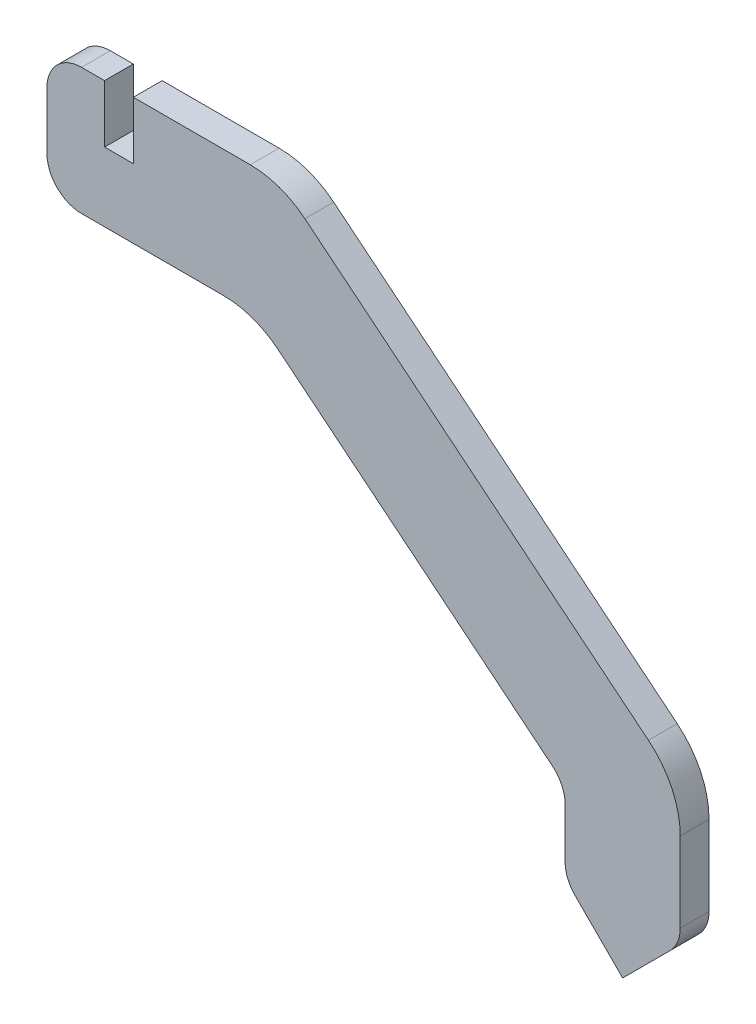
ISO-10303-21;
HEADER;
FILE_DESCRIPTION(('STEP AP214'),'2;1');
FILE_NAME('part.step','',(''),(''),'','','');
FILE_SCHEMA(('AUTOMOTIVE_DESIGN { 1 0 10303 214 1 1 1 1 }'));
ENDSEC;
DATA;
#1=APPLICATION_CONTEXT('core data for automotive mechanical design processes');
#2=APPLICATION_PROTOCOL_DEFINITION('international standard','automotive_design',2000,#1);
#3=PRODUCT_CONTEXT('',#1,'mechanical');
#4=PRODUCT('Part','Part','',(#3));
#5=PRODUCT_RELATED_PRODUCT_CATEGORY('part','',(#4));
#6=PRODUCT_DEFINITION_FORMATION('','',#4);
#7=PRODUCT_DEFINITION_CONTEXT('part definition',#1,'design');
#8=PRODUCT_DEFINITION('design','',#6,#7);
#9=PRODUCT_DEFINITION_SHAPE('','',#8);
#10=(LENGTH_UNIT() NAMED_UNIT(*) SI_UNIT(.MILLI.,.METRE.));
#11=(NAMED_UNIT(*) PLANE_ANGLE_UNIT() SI_UNIT($,.RADIAN.));
#12=(NAMED_UNIT(*) SI_UNIT($,.STERADIAN.) SOLID_ANGLE_UNIT());
#13=UNCERTAINTY_MEASURE_WITH_UNIT(LENGTH_MEASURE(1.E-05),#10,'distance_accuracy_value','');
#14=(GEOMETRIC_REPRESENTATION_CONTEXT(3) GLOBAL_UNCERTAINTY_ASSIGNED_CONTEXT((#13)) GLOBAL_UNIT_ASSIGNED_CONTEXT((#10,
#11,#12)) REPRESENTATION_CONTEXT('',''));
#15=CARTESIAN_POINT('',(0.,0.,0.));
#16=DIRECTION('',(0.,0.,1.));
#17=DIRECTION('',(1.,0.,0.));
#18=AXIS2_PLACEMENT_3D('',#15,#16,#17);
#19=CARTESIAN_POINT('',(1.8,0.,0.125));
#20=DIRECTION('',(0.,1.,0.));
#21=DIRECTION('',(-1.,0.,0.));
#22=AXIS2_PLACEMENT_3D('',#19,#20,#21);
#23=PLANE('',#22);
#24=DIRECTION('',(1.,0.,0.));
#25=VECTOR('',#24,1.);
#26=CARTESIAN_POINT('',(1.8,0.,-0.125));
#27=LINE('',#26,#25);
#28=CARTESIAN_POINT('',(0.3,0.,-0.125));
#29=VERTEX_POINT('',#28);
#30=CARTESIAN_POINT('',(1.53313126586809,0.,-0.125));
#31=VERTEX_POINT('',#30);
#32=EDGE_CURVE('E228',#29,#31,#27,.T.);
#33=ORIENTED_EDGE('',*,*,#32,.T.);
#34=DIRECTION('',(0.,0.,-1.));
#35=VECTOR('',#34,1.);
#36=CARTESIAN_POINT('',(1.53313126586809,0.,0.125));
#37=LINE('',#36,#35);
#38=CARTESIAN_POINT('',(1.53313126586809,0.,0.125));
#39=VERTEX_POINT('',#38);
#40=EDGE_CURVE('E55',#31,#39,#37,.F.);
#41=ORIENTED_EDGE('',*,*,#40,.T.);
#42=DIRECTION('',(1.,0.,0.));
#43=VECTOR('',#42,1.);
#44=CARTESIAN_POINT('',(1.8,0.,0.125));
#45=LINE('',#44,#43);
#46=CARTESIAN_POINT('',(0.3,0.,0.125));
#47=VERTEX_POINT('',#46);
#48=EDGE_CURVE('E258',#47,#39,#45,.T.);
#49=ORIENTED_EDGE('',*,*,#48,.F.);
#50=DIRECTION('',(0.,0.,-1.));
#51=VECTOR('',#50,1.);
#52=CARTESIAN_POINT('',(0.3,0.,0.125));
#53=LINE('',#52,#51);
#54=EDGE_CURVE('E304',#47,#29,#53,.T.);
#55=ORIENTED_EDGE('',*,*,#54,.T.);
#56=EDGE_LOOP('',(#33,#41,#49,#55));
#57=FACE_BOUND('',#56,.T.);
#58=ADVANCED_FACE('F34',(#57),#23,.F.);
#59=CARTESIAN_POINT('',(4.5,-2.2,0.125));
#60=DIRECTION('',(0.631672951162236,0.77523498551729,0.));
#61=DIRECTION('',(-0.77523498551729,0.631672951162236,0.));
#62=AXIS2_PLACEMENT_3D('',#59,#60,#61);
#63=PLANE('',#62);
#64=DIRECTION('',(0.775234985517289,-0.631672951162236,0.));
#65=VECTOR('',#64,1.);
#66=CARTESIAN_POINT('',(4.5,-2.2,0.125));
#67=LINE('',#66,#65);
#68=CARTESIAN_POINT('',(2.00688597923977,-0.168573760862032,0.125));
#69=VERTEX_POINT('',#68);
#70=CARTESIAN_POINT('',(4.38950188534867,-2.10996449917299,0.125));
#71=VERTEX_POINT('',#70);
#72=EDGE_CURVE('E343',#69,#71,#67,.T.);
#73=ORIENTED_EDGE('',*,*,#72,.F.);
#74=DIRECTION('',(0.,0.,-1.));
#75=VECTOR('',#74,1.);
#76=CARTESIAN_POINT('',(2.00688597923977,-0.168573760862032,-0.125));
#77=LINE('',#76,#75);
#78=CARTESIAN_POINT('',(2.00688597923977,-0.168573760862032,-0.125));
#79=VERTEX_POINT('',#78);
#80=EDGE_CURVE('E330',#69,#79,#77,.T.);
#81=ORIENTED_EDGE('',*,*,#80,.T.);
#82=DIRECTION('',(0.775234985517289,-0.631672951162236,0.));
#83=VECTOR('',#82,1.);
#84=CARTESIAN_POINT('',(4.5,-2.2,-0.125));
#85=LINE('',#84,#83);
#86=CARTESIAN_POINT('',(4.38950188534867,-2.10996449917299,-0.125));
#87=VERTEX_POINT('',#86);
#88=EDGE_CURVE('E230',#79,#87,#85,.T.);
#89=ORIENTED_EDGE('',*,*,#88,.T.);
#90=DIRECTION('',(0.,0.,-1.));
#91=VECTOR('',#90,1.);
#92=CARTESIAN_POINT('',(4.38950188534867,-2.10996449917299,0.125));
#93=LINE('',#92,#91);
#94=EDGE_CURVE('E301',#87,#71,#93,.F.);
#95=ORIENTED_EDGE('',*,*,#94,.T.);
#96=EDGE_LOOP('',(#73,#81,#89,#95));
#97=FACE_BOUND('',#96,.T.);
#98=ADVANCED_FACE('F342',(#97),#63,.F.);
#99=CARTESIAN_POINT('',(4.5,-2.9,0.125));
#100=DIRECTION('',(1.,0.,0.));
#101=DIRECTION('',(0.,0.,-1.));
#102=AXIS2_PLACEMENT_3D('',#99,#100,#101);
#103=PLANE('',#102);
#104=DIRECTION('',(0.,-1.,0.));
#105=VECTOR('',#104,1.);
#106=CARTESIAN_POINT('',(4.5,-2.9,-0.125));
#107=LINE('',#106,#105);
#108=CARTESIAN_POINT('',(4.5,-2.34253499482818,-0.125));
#109=VERTEX_POINT('',#108);
#110=CARTESIAN_POINT('',(4.5,-2.77573593128807,-0.125));
#111=VERTEX_POINT('',#110);
#112=EDGE_CURVE('E232',#109,#111,#107,.T.);
#113=ORIENTED_EDGE('',*,*,#112,.T.);
#114=DIRECTION('',(0.,0.,-1.));
#115=VECTOR('',#114,1.);
#116=CARTESIAN_POINT('',(4.5,-2.77573593128807,0.125));
#117=LINE('',#116,#115);
#118=CARTESIAN_POINT('',(4.5,-2.77573593128807,0.125));
#119=VERTEX_POINT('',#118);
#120=EDGE_CURVE('E292',#111,#119,#117,.F.);
#121=ORIENTED_EDGE('',*,*,#120,.T.);
#122=DIRECTION('',(0.,-1.,0.));
#123=VECTOR('',#122,1.);
#124=CARTESIAN_POINT('',(4.5,-2.9,0.125));
#125=LINE('',#124,#123);
#126=CARTESIAN_POINT('',(4.5,-2.34253499482818,0.125));
#127=VERTEX_POINT('',#126);
#128=EDGE_CURVE('E189',#127,#119,#125,.T.);
#129=ORIENTED_EDGE('',*,*,#128,.F.);
#130=DIRECTION('',(0.,0.,-1.));
#131=VECTOR('',#130,1.);
#132=CARTESIAN_POINT('',(4.5,-2.34253499482818,-0.125));
#133=LINE('',#132,#131);
#134=EDGE_CURVE('E289',#127,#109,#133,.T.);
#135=ORIENTED_EDGE('',*,*,#134,.T.);
#136=EDGE_LOOP('',(#113,#121,#129,#135));
#137=FACE_BOUND('',#136,.T.);
#138=ADVANCED_FACE('F409',(#137),#103,.F.);
#139=CARTESIAN_POINT('',(5.,-3.4,0.125));
#140=DIRECTION('',(0.707106781186547,0.707106781186548,0.));
#141=DIRECTION('',(-0.707106781186548,0.707106781186547,0.));
#142=AXIS2_PLACEMENT_3D('',#139,#140,#141);
#143=PLANE('',#142);
#144=DIRECTION('',(0.707106781186548,-0.707106781186547,0.));
#145=VECTOR('',#144,1.);
#146=CARTESIAN_POINT('',(5.,-3.4,0.125));
#147=LINE('',#146,#145);
#148=CARTESIAN_POINT('',(4.58786796564404,-2.98786796564404,0.125));
#149=VERTEX_POINT('',#148);
#150=CARTESIAN_POINT('',(5.,-3.4,0.125));
#151=VERTEX_POINT('',#150);
#152=EDGE_CURVE('E176',#149,#151,#147,.T.);
#153=ORIENTED_EDGE('',*,*,#152,.F.);
#154=DIRECTION('',(0.,0.,-1.));
#155=VECTOR('',#154,1.);
#156=CARTESIAN_POINT('',(4.58786796564404,-2.98786796564404,0.125));
#157=LINE('',#156,#155);
#158=CARTESIAN_POINT('',(4.58786796564404,-2.98786796564404,-0.125));
#159=VERTEX_POINT('',#158);
#160=EDGE_CURVE('E287',#149,#159,#157,.T.);
#161=ORIENTED_EDGE('',*,*,#160,.T.);
#162=DIRECTION('',(0.707106781186548,-0.707106781186547,0.));
#163=VECTOR('',#162,1.);
#164=CARTESIAN_POINT('',(5.,-3.4,-0.125));
#165=LINE('',#164,#163);
#166=CARTESIAN_POINT('',(5.,-3.4,-0.125));
#167=VERTEX_POINT('',#166);
#168=EDGE_CURVE('E195',#159,#167,#165,.T.);
#169=ORIENTED_EDGE('',*,*,#168,.T.);
#170=DIRECTION('',(0.,0.,-1.));
#171=VECTOR('',#170,1.);
#172=CARTESIAN_POINT('',(5.,-3.4,0.125));
#173=LINE('',#172,#171);
#174=EDGE_CURVE('E192',#151,#167,#173,.T.);
#175=ORIENTED_EDGE('',*,*,#174,.F.);
#176=EDGE_LOOP('',(#153,#161,#169,#175));
#177=FACE_BOUND('',#176,.T.);
#178=ADVANCED_FACE('F193',(#177),#143,.F.);
#179=CARTESIAN_POINT('',(5.5,-2.9,0.125));
#180=DIRECTION('',(-0.707106781186548,0.707106781186547,0.));
#181=DIRECTION('',(-0.707106781186547,-0.707106781186548,0.));
#182=AXIS2_PLACEMENT_3D('',#179,#180,#181);
#183=PLANE('',#182);
#184=DIRECTION('',(0.707106781186547,0.707106781186548,0.));
#185=VECTOR('',#184,1.);
#186=CARTESIAN_POINT('',(5.5,-2.9,-0.125));
#187=LINE('',#186,#185);
#188=CARTESIAN_POINT('',(5.41213203435596,-2.98786796564403,-0.125));
#189=VERTEX_POINT('',#188);
#190=EDGE_CURVE('E236',#167,#189,#187,.T.);
#191=ORIENTED_EDGE('',*,*,#190,.T.);
#192=DIRECTION('',(0.,0.,-1.));
#193=VECTOR('',#192,1.);
#194=CARTESIAN_POINT('',(5.41213203435596,-2.98786796564403,0.125));
#195=LINE('',#194,#193);
#196=CARTESIAN_POINT('',(5.41213203435596,-2.98786796564403,0.125));
#197=VERTEX_POINT('',#196);
#198=EDGE_CURVE('E204',#189,#197,#195,.F.);
#199=ORIENTED_EDGE('',*,*,#198,.T.);
#200=DIRECTION('',(0.707106781186547,0.707106781186548,0.));
#201=VECTOR('',#200,1.);
#202=CARTESIAN_POINT('',(5.5,-2.9,0.125));
#203=LINE('',#202,#201);
#204=EDGE_CURVE('E181',#151,#197,#203,.T.);
#205=ORIENTED_EDGE('',*,*,#204,.F.);
#206=ORIENTED_EDGE('',*,*,#174,.T.);
#207=EDGE_LOOP('',(#191,#199,#205,#206));
#208=FACE_BOUND('',#207,.T.);
#209=ADVANCED_FACE('F202',(#208),#183,.F.);
#210=CARTESIAN_POINT('',(5.5,-1.72488335057274,0.125));
#211=DIRECTION('',(-1.,0.,0.));
#212=DIRECTION('',(0.,-1.,0.));
#213=AXIS2_PLACEMENT_3D('',#210,#211,#212);
#214=PLANE('',#213);
#215=DIRECTION('',(0.,1.,0.));
#216=VECTOR('',#215,1.);
#217=CARTESIAN_POINT('',(5.5,-1.72488335057274,-0.125));
#218=LINE('',#217,#216);
#219=CARTESIAN_POINT('',(5.5,-2.77573593128807,-0.125));
#220=VERTEX_POINT('',#219);
#221=CARTESIAN_POINT('',(5.5,-2.08122083764319,-0.125));
#222=VERTEX_POINT('',#221);
#223=EDGE_CURVE('E238',#220,#222,#218,.T.);
#224=ORIENTED_EDGE('',*,*,#223,.T.);
#225=DIRECTION('',(0.,0.,-1.));
#226=VECTOR('',#225,1.);
#227=CARTESIAN_POINT('',(5.5,-2.08122083764319,0.125));
#228=LINE('',#227,#226);
#229=CARTESIAN_POINT('',(5.5,-2.08122083764319,0.125));
#230=VERTEX_POINT('',#229);
#231=EDGE_CURVE('E321',#222,#230,#228,.F.);
#232=ORIENTED_EDGE('',*,*,#231,.T.);
#233=DIRECTION('',(0.,1.,0.));
#234=VECTOR('',#233,1.);
#235=CARTESIAN_POINT('',(5.5,-1.72488335057274,0.125));
#236=LINE('',#235,#234);
#237=CARTESIAN_POINT('',(5.5,-2.77573593128807,0.125));
#238=VERTEX_POINT('',#237);
#239=EDGE_CURVE('E205',#238,#230,#236,.T.);
#240=ORIENTED_EDGE('',*,*,#239,.F.);
#241=DIRECTION('',(0.,0.,-1.));
#242=VECTOR('',#241,1.);
#243=CARTESIAN_POINT('',(5.5,-2.77573593128807,0.125));
#244=LINE('',#243,#242);
#245=EDGE_CURVE('E199',#238,#220,#244,.T.);
#246=ORIENTED_EDGE('',*,*,#245,.T.);
#247=EDGE_LOOP('',(#224,#232,#240,#246));
#248=FACE_BOUND('',#247,.T.);
#249=ADVANCED_FACE('F400',(#248),#214,.F.);
#250=CARTESIAN_POINT('',(2.03309770611527,1.1,0.125));
#251=DIRECTION('',(-0.631672951162236,-0.77523498551729,0.));
#252=DIRECTION('',(0.77523498551729,-0.631672951162236,0.));
#253=AXIS2_PLACEMENT_3D('',#250,#251,#252);
#254=PLANE('',#253);
#255=DIRECTION('',(-0.775234985517289,0.631672951162236,0.));
#256=VECTOR('',#255,1.);
#257=CARTESIAN_POINT('',(2.03309770611527,1.1,0.125));
#258=LINE('',#257,#256);
#259=CARTESIAN_POINT('',(5.22375471337168,-1.49979459850522,0.125));
#260=VERTEX_POINT('',#259);
#261=CARTESIAN_POINT('',(2.23998368535504,0.931426239137967,0.125));
#262=VERTEX_POINT('',#261);
#263=EDGE_CURVE('E207',#260,#262,#258,.T.);
#264=ORIENTED_EDGE('',*,*,#263,.F.);
#265=DIRECTION('',(0.,0.,-1.));
#266=VECTOR('',#265,1.);
#267=CARTESIAN_POINT('',(5.22375471337168,-1.49979459850522,0.125));
#268=LINE('',#267,#266);
#269=CARTESIAN_POINT('',(5.22375471337168,-1.49979459850522,-0.125));
#270=VERTEX_POINT('',#269);
#271=EDGE_CURVE('E314',#260,#270,#268,.T.);
#272=ORIENTED_EDGE('',*,*,#271,.T.);
#273=DIRECTION('',(-0.775234985517289,0.631672951162236,0.));
#274=VECTOR('',#273,1.);
#275=CARTESIAN_POINT('',(2.03309770611527,1.1,-0.125));
#276=LINE('',#275,#274);
#277=CARTESIAN_POINT('',(2.23998368535504,0.931426239137967,-0.125));
#278=VERTEX_POINT('',#277);
#279=EDGE_CURVE('E241',#270,#278,#276,.T.);
#280=ORIENTED_EDGE('',*,*,#279,.T.);
#281=DIRECTION('',(0.,0.,-1.));
#282=VECTOR('',#281,1.);
#283=CARTESIAN_POINT('',(2.23998368535504,0.931426239137967,0.125));
#284=LINE('',#283,#282);
#285=EDGE_CURVE('E312',#278,#262,#284,.F.);
#286=ORIENTED_EDGE('',*,*,#285,.T.);
#287=EDGE_LOOP('',(#264,#272,#280,#286));
#288=FACE_BOUND('',#287,.T.);
#289=ADVANCED_FACE('F390',(#288),#254,.F.);
#290=CARTESIAN_POINT('',(0.75,1.1,0.125));
#291=DIRECTION('',(0.,-1.,0.));
#292=DIRECTION('',(0.,0.,-1.));
#293=AXIS2_PLACEMENT_3D('',#290,#291,#292);
#294=PLANE('',#293);
#295=DIRECTION('',(-1.,0.,0.));
#296=VECTOR('',#295,1.);
#297=CARTESIAN_POINT('',(0.75,1.1,0.125));
#298=LINE('',#297,#296);
#299=CARTESIAN_POINT('',(1.76622897198336,1.1,0.125));
#300=VERTEX_POINT('',#299);
#301=CARTESIAN_POINT('',(0.75,1.1,0.125));
#302=VERTEX_POINT('',#301);
#303=EDGE_CURVE('E213',#300,#302,#298,.T.);
#304=ORIENTED_EDGE('',*,*,#303,.F.);
#305=DIRECTION('',(0.,0.,-1.));
#306=VECTOR('',#305,1.);
#307=CARTESIAN_POINT('',(1.76622897198336,1.1,0.125));
#308=LINE('',#307,#306);
#309=CARTESIAN_POINT('',(1.76622897198336,1.1,-0.125));
#310=VERTEX_POINT('',#309);
#311=EDGE_CURVE('E327',#300,#310,#308,.T.);
#312=ORIENTED_EDGE('',*,*,#311,.T.);
#313=DIRECTION('',(-1.,0.,0.));
#314=VECTOR('',#313,1.);
#315=CARTESIAN_POINT('',(0.75,1.1,-0.125));
#316=LINE('',#315,#314);
#317=CARTESIAN_POINT('',(0.75,1.1,-0.125));
#318=VERTEX_POINT('',#317);
#319=EDGE_CURVE('E244',#310,#318,#316,.T.);
#320=ORIENTED_EDGE('',*,*,#319,.T.);
#321=DIRECTION('',(0.,0.,-1.));
#322=VECTOR('',#321,1.);
#323=CARTESIAN_POINT('',(0.75,1.1,0.125));
#324=LINE('',#323,#322);
#325=EDGE_CURVE('E200',#302,#318,#324,.T.);
#326=ORIENTED_EDGE('',*,*,#325,.F.);
#327=EDGE_LOOP('',(#304,#312,#320,#326));
#328=FACE_BOUND('',#327,.T.);
#329=ADVANCED_FACE('F384',(#328),#294,.F.);
#330=CARTESIAN_POINT('',(0.75,0.6,0.125));
#331=DIRECTION('',(1.,0.,0.));
#332=DIRECTION('',(0.,0.,-1.));
#333=AXIS2_PLACEMENT_3D('',#330,#331,#332);
#334=PLANE('',#333);
#335=DIRECTION('',(0.,-1.,0.));
#336=VECTOR('',#335,1.);
#337=CARTESIAN_POINT('',(0.75,0.6,-0.125));
#338=LINE('',#337,#336);
#339=CARTESIAN_POINT('',(0.75,0.6,-0.125));
#340=VERTEX_POINT('',#339);
#341=EDGE_CURVE('E246',#318,#340,#338,.T.);
#342=ORIENTED_EDGE('',*,*,#341,.T.);
#343=DIRECTION('',(0.,0.,-1.));
#344=VECTOR('',#343,1.);
#345=CARTESIAN_POINT('',(0.75,0.6,0.125));
#346=LINE('',#345,#344);
#347=CARTESIAN_POINT('',(0.75,0.6,0.125));
#348=VERTEX_POINT('',#347);
#349=EDGE_CURVE('E264',#348,#340,#346,.T.);
#350=ORIENTED_EDGE('',*,*,#349,.F.);
#351=DIRECTION('',(0.,-1.,0.));
#352=VECTOR('',#351,1.);
#353=CARTESIAN_POINT('',(0.75,0.6,0.125));
#354=LINE('',#353,#352);
#355=EDGE_CURVE('E215',#302,#348,#354,.T.);
#356=ORIENTED_EDGE('',*,*,#355,.F.);
#357=ORIENTED_EDGE('',*,*,#325,.T.);
#358=EDGE_LOOP('',(#342,#350,#356,#357));
#359=FACE_BOUND('',#358,.T.);
#360=ADVANCED_FACE('F380',(#359),#334,.F.);
#361=CARTESIAN_POINT('',(0.5,0.6,0.125));
#362=DIRECTION('',(0.,-1.,0.));
#363=DIRECTION('',(0.,0.,-1.));
#364=AXIS2_PLACEMENT_3D('',#361,#362,#363);
#365=PLANE('',#364);
#366=DIRECTION('',(-1.,0.,0.));
#367=VECTOR('',#366,1.);
#368=CARTESIAN_POINT('',(0.5,0.6,-0.125));
#369=LINE('',#368,#367);
#370=CARTESIAN_POINT('',(0.5,0.6,-0.125));
#371=VERTEX_POINT('',#370);
#372=EDGE_CURVE('E248',#340,#371,#369,.T.);
#373=ORIENTED_EDGE('',*,*,#372,.T.);
#374=DIRECTION('',(0.,0.,-1.));
#375=VECTOR('',#374,1.);
#376=CARTESIAN_POINT('',(0.5,0.6,0.125));
#377=LINE('',#376,#375);
#378=CARTESIAN_POINT('',(0.5,0.6,0.125));
#379=VERTEX_POINT('',#378);
#380=EDGE_CURVE('E261',#379,#371,#377,.T.);
#381=ORIENTED_EDGE('',*,*,#380,.F.);
#382=DIRECTION('',(-1.,0.,0.));
#383=VECTOR('',#382,1.);
#384=CARTESIAN_POINT('',(0.5,0.6,0.125));
#385=LINE('',#384,#383);
#386=EDGE_CURVE('E217',#348,#379,#385,.T.);
#387=ORIENTED_EDGE('',*,*,#386,.F.);
#388=ORIENTED_EDGE('',*,*,#349,.T.);
#389=EDGE_LOOP('',(#373,#381,#387,#388));
#390=FACE_BOUND('',#389,.T.);
#391=ADVANCED_FACE('F375',(#390),#365,.F.);
#392=CARTESIAN_POINT('',(0.5,1.1,0.125));
#393=DIRECTION('',(-1.,0.,0.));
#394=DIRECTION('',(0.,-1.,0.));
#395=AXIS2_PLACEMENT_3D('',#392,#393,#394);
#396=PLANE('',#395);
#397=DIRECTION('',(0.,1.,0.));
#398=VECTOR('',#397,1.);
#399=CARTESIAN_POINT('',(0.5,1.1,-0.125));
#400=LINE('',#399,#398);
#401=CARTESIAN_POINT('',(0.5,1.1,-0.125));
#402=VERTEX_POINT('',#401);
#403=EDGE_CURVE('E250',#371,#402,#400,.T.);
#404=ORIENTED_EDGE('',*,*,#403,.T.);
#405=DIRECTION('',(0.,0.,-1.));
#406=VECTOR('',#405,1.);
#407=CARTESIAN_POINT('',(0.5,1.1,0.125));
#408=LINE('',#407,#406);
#409=CARTESIAN_POINT('',(0.5,1.1,0.125));
#410=VERTEX_POINT('',#409);
#411=EDGE_CURVE('E227',#410,#402,#408,.T.);
#412=ORIENTED_EDGE('',*,*,#411,.F.);
#413=DIRECTION('',(0.,1.,0.));
#414=VECTOR('',#413,1.);
#415=CARTESIAN_POINT('',(0.5,1.1,0.125));
#416=LINE('',#415,#414);
#417=EDGE_CURVE('E219',#379,#410,#416,.T.);
#418=ORIENTED_EDGE('',*,*,#417,.F.);
#419=ORIENTED_EDGE('',*,*,#380,.T.);
#420=EDGE_LOOP('',(#404,#412,#418,#419));
#421=FACE_BOUND('',#420,.T.);
#422=ADVANCED_FACE('F369',(#421),#396,.F.);
#423=CARTESIAN_POINT('',(0.,1.1,0.125));
#424=DIRECTION('',(0.,-1.,0.));
#425=DIRECTION('',(0.,0.,-1.));
#426=AXIS2_PLACEMENT_3D('',#423,#424,#425);
#427=PLANE('',#426);
#428=DIRECTION('',(-1.,0.,0.));
#429=VECTOR('',#428,1.);
#430=CARTESIAN_POINT('',(0.,1.1,-0.125));
#431=LINE('',#430,#429);
#432=CARTESIAN_POINT('',(0.3,1.1,-0.125));
#433=VERTEX_POINT('',#432);
#434=EDGE_CURVE('E252',#402,#433,#431,.T.);
#435=ORIENTED_EDGE('',*,*,#434,.T.);
#436=DIRECTION('',(0.,0.,-1.));
#437=VECTOR('',#436,1.);
#438=CARTESIAN_POINT('',(0.3,1.1,0.125));
#439=LINE('',#438,#437);
#440=CARTESIAN_POINT('',(0.3,1.1,0.125));
#441=VERTEX_POINT('',#440);
#442=EDGE_CURVE('E299',#433,#441,#439,.F.);
#443=ORIENTED_EDGE('',*,*,#442,.T.);
#444=DIRECTION('',(-1.,0.,0.));
#445=VECTOR('',#444,1.);
#446=CARTESIAN_POINT('',(0.,1.1,0.125));
#447=LINE('',#446,#445);
#448=EDGE_CURVE('E221',#410,#441,#447,.T.);
#449=ORIENTED_EDGE('',*,*,#448,.F.);
#450=ORIENTED_EDGE('',*,*,#411,.T.);
#451=EDGE_LOOP('',(#435,#443,#449,#450));
#452=FACE_BOUND('',#451,.T.);
#453=ADVANCED_FACE('F364',(#452),#427,.F.);
#454=CARTESIAN_POINT('',(0.,0.,0.125));
#455=DIRECTION('',(1.,0.,0.));
#456=DIRECTION('',(0.,0.,-1.));
#457=AXIS2_PLACEMENT_3D('',#454,#455,#456);
#458=PLANE('',#457);
#459=DIRECTION('',(0.,-1.,0.));
#460=VECTOR('',#459,1.);
#461=CARTESIAN_POINT('',(0.,0.,0.125));
#462=LINE('',#461,#460);
#463=CARTESIAN_POINT('',(0.,0.8,0.125));
#464=VERTEX_POINT('',#463);
#465=CARTESIAN_POINT('',(0.,0.3,0.125));
#466=VERTEX_POINT('',#465);
#467=EDGE_CURVE('E224',#464,#466,#462,.T.);
#468=ORIENTED_EDGE('',*,*,#467,.F.);
#469=DIRECTION('',(0.,0.,-1.));
#470=VECTOR('',#469,1.);
#471=CARTESIAN_POINT('',(0.,0.8,0.125));
#472=LINE('',#471,#470);
#473=CARTESIAN_POINT('',(0.,0.8,-0.125));
#474=VERTEX_POINT('',#473);
#475=EDGE_CURVE('E296',#464,#474,#472,.T.);
#476=ORIENTED_EDGE('',*,*,#475,.T.);
#477=DIRECTION('',(0.,-1.,0.));
#478=VECTOR('',#477,1.);
#479=CARTESIAN_POINT('',(0.,0.,-0.125));
#480=LINE('',#479,#478);
#481=CARTESIAN_POINT('',(0.,0.3,-0.125));
#482=VERTEX_POINT('',#481);
#483=EDGE_CURVE('E255',#474,#482,#480,.T.);
#484=ORIENTED_EDGE('',*,*,#483,.T.);
#485=DIRECTION('',(0.,0.,-1.));
#486=VECTOR('',#485,1.);
#487=CARTESIAN_POINT('',(0.,0.3,0.125));
#488=LINE('',#487,#486);
#489=EDGE_CURVE('E294',#482,#466,#488,.F.);
#490=ORIENTED_EDGE('',*,*,#489,.T.);
#491=EDGE_LOOP('',(#468,#476,#484,#490));
#492=FACE_BOUND('',#491,.T.);
#493=ADVANCED_FACE('F355',(#492),#458,.F.);
#494=CARTESIAN_POINT('',(0.,0.,0.125));
#495=DIRECTION('',(0.,0.,-1.));
#496=DIRECTION('',(-1.,0.,0.));
#497=AXIS2_PLACEMENT_3D('',#494,#495,#496);
#498=PLANE('',#497);
#499=ORIENTED_EDGE('',*,*,#239,.T.);
#500=CARTESIAN_POINT('',(4.75,-2.08122083764318,0.125));
#501=DIRECTION('',(0.,0.,-1.));
#502=DIRECTION('',(-1.,0.,0.));
#503=AXIS2_PLACEMENT_3D('',#500,#501,#502);
#504=CIRCLE('',#503,0.75);
#505=EDGE_CURVE('E325',#230,#260,#504,.F.);
#506=ORIENTED_EDGE('',*,*,#505,.T.);
#507=ORIENTED_EDGE('',*,*,#263,.T.);
#508=CARTESIAN_POINT('',(1.76622897198336,0.35,0.125));
#509=DIRECTION('',(0.,0.,-1.));
#510=DIRECTION('',(-1.,0.,0.));
#511=AXIS2_PLACEMENT_3D('',#508,#509,#510);
#512=CIRCLE('',#511,0.75);
#513=EDGE_CURVE('E323',#262,#300,#512,.F.);
#514=ORIENTED_EDGE('',*,*,#513,.T.);
#515=ORIENTED_EDGE('',*,*,#303,.T.);
#516=ORIENTED_EDGE('',*,*,#355,.T.);
#517=ORIENTED_EDGE('',*,*,#386,.T.);
#518=ORIENTED_EDGE('',*,*,#417,.T.);
#519=ORIENTED_EDGE('',*,*,#448,.T.);
#520=CARTESIAN_POINT('',(0.3,0.8,0.125));
#521=DIRECTION('',(0.,0.,-1.));
#522=DIRECTION('',(-1.,0.,0.));
#523=AXIS2_PLACEMENT_3D('',#520,#521,#522);
#524=CIRCLE('',#523,0.3);
#525=EDGE_CURVE('E282',#441,#464,#524,.F.);
#526=ORIENTED_EDGE('',*,*,#525,.T.);
#527=ORIENTED_EDGE('',*,*,#467,.T.);
#528=CARTESIAN_POINT('',(0.3,0.3,0.125));
#529=DIRECTION('',(0.,0.,-1.));
#530=DIRECTION('',(-1.,0.,0.));
#531=AXIS2_PLACEMENT_3D('',#528,#529,#530);
#532=CIRCLE('',#531,0.3);
#533=EDGE_CURVE('E280',#466,#47,#532,.F.);
#534=ORIENTED_EDGE('',*,*,#533,.T.);
#535=ORIENTED_EDGE('',*,*,#48,.T.);
#536=CARTESIAN_POINT('',(1.53313126586809,-0.75,0.125));
#537=DIRECTION('',(0.,0.,-1.));
#538=DIRECTION('',(-1.,0.,0.));
#539=AXIS2_PLACEMENT_3D('',#536,#537,#538);
#540=CIRCLE('',#539,0.75);
#541=EDGE_CURVE('E11',#39,#69,#540,.T.);
#542=ORIENTED_EDGE('',*,*,#541,.T.);
#543=ORIENTED_EDGE('',*,*,#72,.T.);
#544=CARTESIAN_POINT('',(4.2,-2.34253499482818,0.125));
#545=DIRECTION('',(0.,0.,-1.));
#546=DIRECTION('',(-1.,0.,0.));
#547=AXIS2_PLACEMENT_3D('',#544,#545,#546);
#548=CIRCLE('',#547,0.3);
#549=EDGE_CURVE('E310',#71,#127,#548,.T.);
#550=ORIENTED_EDGE('',*,*,#549,.T.);
#551=ORIENTED_EDGE('',*,*,#128,.T.);
#552=CARTESIAN_POINT('',(4.8,-2.77573593128807,0.125));
#553=DIRECTION('',(0.,0.,-1.));
#554=DIRECTION('',(-1.,0.,0.));
#555=AXIS2_PLACEMENT_3D('',#552,#553,#554);
#556=CIRCLE('',#555,0.3);
#557=EDGE_CURVE('E185',#119,#149,#556,.F.);
#558=ORIENTED_EDGE('',*,*,#557,.T.);
#559=ORIENTED_EDGE('',*,*,#152,.T.);
#560=ORIENTED_EDGE('',*,*,#204,.T.);
#561=CARTESIAN_POINT('',(5.2,-2.77573593128807,0.125));
#562=DIRECTION('',(0.,0.,-1.));
#563=DIRECTION('',(-1.,0.,0.));
#564=AXIS2_PLACEMENT_3D('',#561,#562,#563);
#565=CIRCLE('',#564,0.3);
#566=EDGE_CURVE('E285',#197,#238,#565,.F.);
#567=ORIENTED_EDGE('',*,*,#566,.T.);
#568=EDGE_LOOP('',(#499,#506,#507,#514,#515,#516,#517,#518,#519,#526,#527,#534,#535,#542,#543,
#550,#551,#558,#559,#560,#567));
#569=FACE_BOUND('',#568,.T.);
#570=ADVANCED_FACE('F179',(#569),#498,.F.);
#571=CARTESIAN_POINT('',(0.,0.,-0.125));
#572=DIRECTION('',(0.,0.,-1.));
#573=DIRECTION('',(-1.,0.,0.));
#574=AXIS2_PLACEMENT_3D('',#571,#572,#573);
#575=PLANE('',#574);
#576=ORIENTED_EDGE('',*,*,#279,.F.);
#577=CARTESIAN_POINT('',(4.75,-2.08122083764318,-0.125));
#578=DIRECTION('',(0.,0.,-1.));
#579=DIRECTION('',(-1.,0.,0.));
#580=AXIS2_PLACEMENT_3D('',#577,#578,#579);
#581=CIRCLE('',#580,0.75);
#582=EDGE_CURVE('E319',#270,#222,#581,.T.);
#583=ORIENTED_EDGE('',*,*,#582,.T.);
#584=ORIENTED_EDGE('',*,*,#223,.F.);
#585=CARTESIAN_POINT('',(5.2,-2.77573593128807,-0.125));
#586=DIRECTION('',(0.,0.,-1.));
#587=DIRECTION('',(-1.,0.,0.));
#588=AXIS2_PLACEMENT_3D('',#585,#586,#587);
#589=CIRCLE('',#588,0.3);
#590=EDGE_CURVE('E277',#220,#189,#589,.T.);
#591=ORIENTED_EDGE('',*,*,#590,.T.);
#592=ORIENTED_EDGE('',*,*,#190,.F.);
#593=ORIENTED_EDGE('',*,*,#168,.F.);
#594=CARTESIAN_POINT('',(4.8,-2.77573593128807,-0.125));
#595=DIRECTION('',(0.,0.,-1.));
#596=DIRECTION('',(-1.,0.,0.));
#597=AXIS2_PLACEMENT_3D('',#594,#595,#596);
#598=CIRCLE('',#597,0.3);
#599=EDGE_CURVE('E275',#159,#111,#598,.T.);
#600=ORIENTED_EDGE('',*,*,#599,.T.);
#601=ORIENTED_EDGE('',*,*,#112,.F.);
#602=CARTESIAN_POINT('',(4.2,-2.34253499482818,-0.125));
#603=DIRECTION('',(0.,0.,-1.));
#604=DIRECTION('',(-1.,0.,0.));
#605=AXIS2_PLACEMENT_3D('',#602,#603,#604);
#606=CIRCLE('',#605,0.3);
#607=EDGE_CURVE('E307',#109,#87,#606,.F.);
#608=ORIENTED_EDGE('',*,*,#607,.T.);
#609=ORIENTED_EDGE('',*,*,#88,.F.);
#610=CARTESIAN_POINT('',(1.53313126586809,-0.75,-0.125));
#611=DIRECTION('',(0.,0.,-1.));
#612=DIRECTION('',(-1.,0.,0.));
#613=AXIS2_PLACEMENT_3D('',#610,#611,#612);
#614=CIRCLE('',#613,0.75);
#615=EDGE_CURVE('E42',#79,#31,#614,.F.);
#616=ORIENTED_EDGE('',*,*,#615,.T.);
#617=ORIENTED_EDGE('',*,*,#32,.F.);
#618=CARTESIAN_POINT('',(0.3,0.3,-0.125));
#619=DIRECTION('',(0.,0.,-1.));
#620=DIRECTION('',(-1.,0.,0.));
#621=AXIS2_PLACEMENT_3D('',#618,#619,#620);
#622=CIRCLE('',#621,0.3);
#623=EDGE_CURVE('E271',#29,#482,#622,.T.);
#624=ORIENTED_EDGE('',*,*,#623,.T.);
#625=ORIENTED_EDGE('',*,*,#483,.F.);
#626=CARTESIAN_POINT('',(0.3,0.8,-0.125));
#627=DIRECTION('',(0.,0.,-1.));
#628=DIRECTION('',(-1.,0.,0.));
#629=AXIS2_PLACEMENT_3D('',#626,#627,#628);
#630=CIRCLE('',#629,0.3);
#631=EDGE_CURVE('E273',#474,#433,#630,.T.);
#632=ORIENTED_EDGE('',*,*,#631,.T.);
#633=ORIENTED_EDGE('',*,*,#434,.F.);
#634=ORIENTED_EDGE('',*,*,#403,.F.);
#635=ORIENTED_EDGE('',*,*,#372,.F.);
#636=ORIENTED_EDGE('',*,*,#341,.F.);
#637=ORIENTED_EDGE('',*,*,#319,.F.);
#638=CARTESIAN_POINT('',(1.76622897198336,0.35,-0.125));
#639=DIRECTION('',(0.,0.,-1.));
#640=DIRECTION('',(-1.,0.,0.));
#641=AXIS2_PLACEMENT_3D('',#638,#639,#640);
#642=CIRCLE('',#641,0.75);
#643=EDGE_CURVE('E317',#310,#278,#642,.T.);
#644=ORIENTED_EDGE('',*,*,#643,.T.);
#645=EDGE_LOOP('',(#576,#583,#584,#591,#592,#593,#600,#601,#608,#609,#616,#617,#624,#625,#632,
#633,#634,#635,#636,#637,#644));
#646=FACE_BOUND('',#645,.T.);
#647=ADVANCED_FACE('F337',(#646),#575,.T.);
#648=CARTESIAN_POINT('',(5.2,-2.77573593128807,0.125));
#649=DIRECTION('',(0.,0.,-1.));
#650=DIRECTION('',(-1.,0.,0.));
#651=AXIS2_PLACEMENT_3D('',#648,#649,#650);
#652=CYLINDRICAL_SURFACE('',#651,0.3);
#653=ORIENTED_EDGE('',*,*,#566,.F.);
#654=ORIENTED_EDGE('',*,*,#198,.F.);
#655=ORIENTED_EDGE('',*,*,#590,.F.);
#656=ORIENTED_EDGE('',*,*,#245,.F.);
#657=EDGE_LOOP('',(#653,#654,#655,#656));
#658=FACE_BOUND('',#657,.T.);
#659=ADVANCED_FACE('F404',(#658),#652,.T.);
#660=CARTESIAN_POINT('',(4.8,-2.77573593128807,0.125));
#661=DIRECTION('',(0.,0.,-1.));
#662=DIRECTION('',(-1.,0.,0.));
#663=AXIS2_PLACEMENT_3D('',#660,#661,#662);
#664=CYLINDRICAL_SURFACE('',#663,0.3);
#665=ORIENTED_EDGE('',*,*,#557,.F.);
#666=ORIENTED_EDGE('',*,*,#120,.F.);
#667=ORIENTED_EDGE('',*,*,#599,.F.);
#668=ORIENTED_EDGE('',*,*,#160,.F.);
#669=EDGE_LOOP('',(#665,#666,#667,#668));
#670=FACE_BOUND('',#669,.T.);
#671=ADVANCED_FACE('F412',(#670),#664,.T.);
#672=CARTESIAN_POINT('',(0.3,0.8,0.125));
#673=DIRECTION('',(0.,0.,-1.));
#674=DIRECTION('',(-1.,0.,0.));
#675=AXIS2_PLACEMENT_3D('',#672,#673,#674);
#676=CYLINDRICAL_SURFACE('',#675,0.3);
#677=ORIENTED_EDGE('',*,*,#525,.F.);
#678=ORIENTED_EDGE('',*,*,#442,.F.);
#679=ORIENTED_EDGE('',*,*,#631,.F.);
#680=ORIENTED_EDGE('',*,*,#475,.F.);
#681=EDGE_LOOP('',(#677,#678,#679,#680));
#682=FACE_BOUND('',#681,.T.);
#683=ADVANCED_FACE('F359',(#682),#676,.T.);
#684=CARTESIAN_POINT('',(4.2,-2.34253499482818,0.125));
#685=DIRECTION('',(0.,0.,1.));
#686=DIRECTION('',(1.,0.,0.));
#687=AXIS2_PLACEMENT_3D('',#684,#685,#686);
#688=CYLINDRICAL_SURFACE('',#687,0.3);
#689=ORIENTED_EDGE('',*,*,#549,.F.);
#690=ORIENTED_EDGE('',*,*,#94,.F.);
#691=ORIENTED_EDGE('',*,*,#607,.F.);
#692=ORIENTED_EDGE('',*,*,#134,.F.);
#693=EDGE_LOOP('',(#689,#690,#691,#692));
#694=FACE_BOUND('',#693,.T.);
#695=ADVANCED_FACE('F419',(#694),#688,.F.);
#696=CARTESIAN_POINT('',(0.3,0.3,0.125));
#697=DIRECTION('',(0.,0.,-1.));
#698=DIRECTION('',(-1.,0.,0.));
#699=AXIS2_PLACEMENT_3D('',#696,#697,#698);
#700=CYLINDRICAL_SURFACE('',#699,0.3);
#701=ORIENTED_EDGE('',*,*,#533,.F.);
#702=ORIENTED_EDGE('',*,*,#489,.F.);
#703=ORIENTED_EDGE('',*,*,#623,.F.);
#704=ORIENTED_EDGE('',*,*,#54,.F.);
#705=EDGE_LOOP('',(#701,#702,#703,#704));
#706=FACE_BOUND('',#705,.T.);
#707=ADVANCED_FACE('F350',(#706),#700,.T.);
#708=CARTESIAN_POINT('',(4.75,-2.08122083764318,0.125));
#709=DIRECTION('',(0.,0.,-1.));
#710=DIRECTION('',(-1.,0.,0.));
#711=AXIS2_PLACEMENT_3D('',#708,#709,#710);
#712=CYLINDRICAL_SURFACE('',#711,0.75);
#713=ORIENTED_EDGE('',*,*,#505,.F.);
#714=ORIENTED_EDGE('',*,*,#231,.F.);
#715=ORIENTED_EDGE('',*,*,#582,.F.);
#716=ORIENTED_EDGE('',*,*,#271,.F.);
#717=EDGE_LOOP('',(#713,#714,#715,#716));
#718=FACE_BOUND('',#717,.T.);
#719=ADVANCED_FACE('F396',(#718),#712,.T.);
#720=CARTESIAN_POINT('',(1.76622897198336,0.35,0.125));
#721=DIRECTION('',(0.,0.,-1.));
#722=DIRECTION('',(-1.,0.,0.));
#723=AXIS2_PLACEMENT_3D('',#720,#721,#722);
#724=CYLINDRICAL_SURFACE('',#723,0.75);
#725=ORIENTED_EDGE('',*,*,#513,.F.);
#726=ORIENTED_EDGE('',*,*,#285,.F.);
#727=ORIENTED_EDGE('',*,*,#643,.F.);
#728=ORIENTED_EDGE('',*,*,#311,.F.);
#729=EDGE_LOOP('',(#725,#726,#727,#728));
#730=FACE_BOUND('',#729,.T.);
#731=ADVANCED_FACE('F393',(#730),#724,.T.);
#732=CARTESIAN_POINT('',(1.53313126586809,-0.75,0.125));
#733=DIRECTION('',(0.,0.,1.));
#734=DIRECTION('',(1.,0.,0.));
#735=AXIS2_PLACEMENT_3D('',#732,#733,#734);
#736=CYLINDRICAL_SURFACE('',#735,0.75);
#737=ORIENTED_EDGE('',*,*,#541,.F.);
#738=ORIENTED_EDGE('',*,*,#40,.F.);
#739=ORIENTED_EDGE('',*,*,#615,.F.);
#740=ORIENTED_EDGE('',*,*,#80,.F.);
#741=EDGE_LOOP('',(#737,#738,#739,#740));
#742=FACE_BOUND('',#741,.T.);
#743=ADVANCED_FACE('F36',(#742),#736,.F.);
#744=CLOSED_SHELL('',(#58,#98,#138,#178,#209,#249,#289,#329,#360,#391,#422,#453,#493,#570,#647,
#659,#671,#683,#695,#707,#719,#731,#743));
#745=MANIFOLD_SOLID_BREP('B2',#744);
#746=ADVANCED_BREP_SHAPE_REPRESENTATION('',(#18,#745),#14);
#747=SHAPE_DEFINITION_REPRESENTATION(#9,#746);
ENDSEC;
END-ISO-10303-21;
